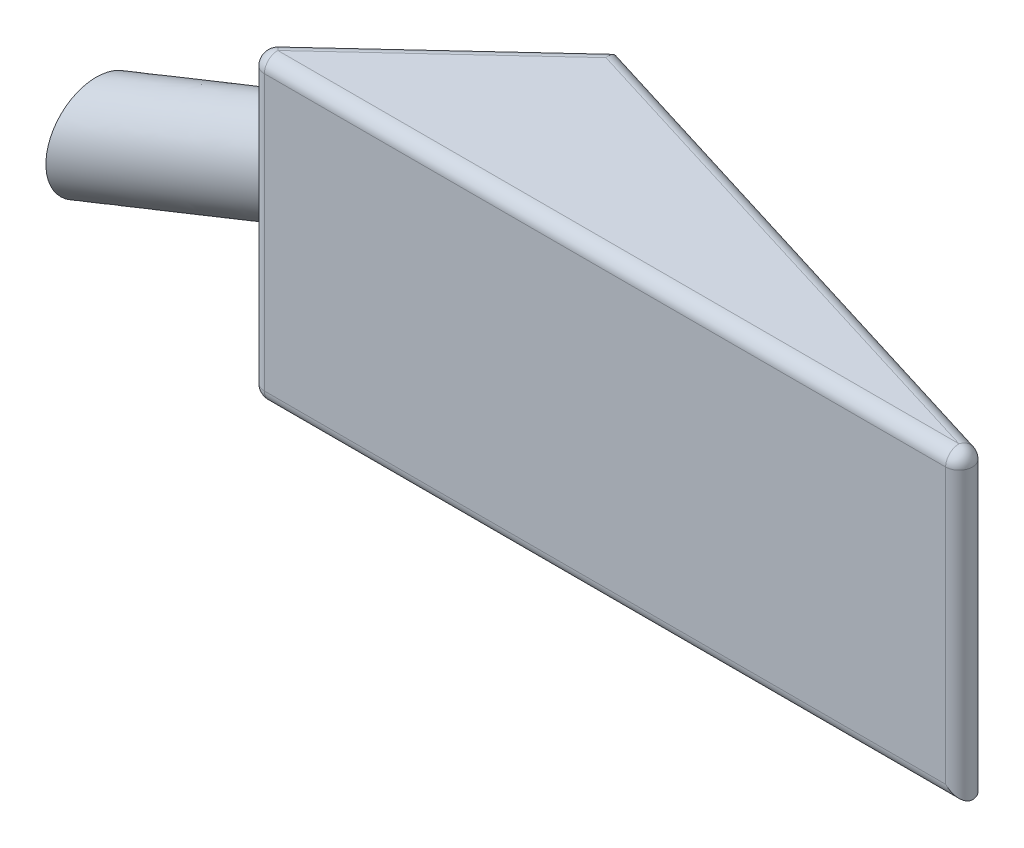
ISO-10303-21;
HEADER;
FILE_DESCRIPTION(('STEP AP214'),'2;1');
FILE_NAME('part.step','',(''),(''),'','','');
FILE_SCHEMA(('AUTOMOTIVE_DESIGN { 1 0 10303 214 1 1 1 1 }'));
ENDSEC;
DATA;
#1=APPLICATION_CONTEXT('core data for automotive mechanical design processes');
#2=APPLICATION_PROTOCOL_DEFINITION('international standard','automotive_design',2000,#1);
#3=PRODUCT_CONTEXT('',#1,'mechanical');
#4=PRODUCT('Part','Part','',(#3));
#5=PRODUCT_RELATED_PRODUCT_CATEGORY('part','',(#4));
#6=PRODUCT_DEFINITION_FORMATION('','',#4);
#7=PRODUCT_DEFINITION_CONTEXT('part definition',#1,'design');
#8=PRODUCT_DEFINITION('design','',#6,#7);
#9=PRODUCT_DEFINITION_SHAPE('','',#8);
#10=(LENGTH_UNIT() NAMED_UNIT(*) SI_UNIT(.MILLI.,.METRE.));
#11=(NAMED_UNIT(*) PLANE_ANGLE_UNIT() SI_UNIT($,.RADIAN.));
#12=(NAMED_UNIT(*) SI_UNIT($,.STERADIAN.) SOLID_ANGLE_UNIT());
#13=UNCERTAINTY_MEASURE_WITH_UNIT(LENGTH_MEASURE(1.E-05),#10,'distance_accuracy_value','');
#14=(GEOMETRIC_REPRESENTATION_CONTEXT(3) GLOBAL_UNCERTAINTY_ASSIGNED_CONTEXT((#13)) GLOBAL_UNIT_ASSIGNED_CONTEXT((#10,
#11,#12)) REPRESENTATION_CONTEXT('',''));
#15=CARTESIAN_POINT('',(0.,0.,0.));
#16=DIRECTION('',(0.,0.,1.));
#17=DIRECTION('',(1.,0.,0.));
#18=AXIS2_PLACEMENT_3D('',#15,#16,#17);
#19=CARTESIAN_POINT('',(20.,22.5,0.));
#20=DIRECTION('',(0.,0.,-1.));
#21=DIRECTION('',(-1.,0.,0.));
#22=AXIS2_PLACEMENT_3D('',#19,#20,#21);
#23=PLANE('',#22);
#24=DIRECTION('',(1.,0.,0.));
#25=VECTOR('',#24,1.);
#26=CARTESIAN_POINT('',(20.,-20.5,0.));
#27=LINE('',#26,#25);
#28=CARTESIAN_POINT('',(25.0995398766592,-20.5,0.));
#29=VERTEX_POINT('',#28);
#30=CARTESIAN_POINT('',(126.75258807811,-20.5,0.));
#31=VERTEX_POINT('',#30);
#32=EDGE_CURVE('E41',#29,#31,#27,.T.);
#33=ORIENTED_EDGE('',*,*,#32,.T.);
#34=DIRECTION('',(0.,-1.,0.));
#35=VECTOR('',#34,1.);
#36=CARTESIAN_POINT('',(126.75258807811,22.5,0.));
#37=LINE('',#36,#35);
#38=CARTESIAN_POINT('',(126.75258807811,20.5,0.));
#39=VERTEX_POINT('',#38);
#40=EDGE_CURVE('E11',#31,#39,#37,.F.);
#41=ORIENTED_EDGE('',*,*,#40,.T.);
#42=DIRECTION('',(1.,0.,0.));
#43=VECTOR('',#42,1.);
#44=CARTESIAN_POINT('',(20.,20.5,0.));
#45=LINE('',#44,#43);
#46=CARTESIAN_POINT('',(25.0995398766592,20.5,0.));
#47=VERTEX_POINT('',#46);
#48=EDGE_CURVE('E151',#39,#47,#45,.F.);
#49=ORIENTED_EDGE('',*,*,#48,.T.);
#50=DIRECTION('',(0.,-1.,0.));
#51=VECTOR('',#50,1.);
#52=CARTESIAN_POINT('',(25.0995398766592,22.5,0.));
#53=LINE('',#52,#51);
#54=EDGE_CURVE('E52',#47,#29,#53,.T.);
#55=ORIENTED_EDGE('',*,*,#54,.T.);
#56=EDGE_LOOP('',(#33,#41,#49,#55));
#57=FACE_BOUND('',#56,.T.);
#58=ADVANCED_FACE('F32',(#57),#23,.F.);
#59=CARTESIAN_POINT('',(50.,22.5,-27.8089638326065));
#60=DIRECTION('',(-0.295216946131995,0.,0.955430245866489));
#61=DIRECTION('',(0.955430245866489,0.,0.295216946131995));
#62=AXIS2_PLACEMENT_3D('',#59,#60,#61);
#63=PLANE('',#62);
#64=DIRECTION('',(-0.955430245866489,0.,-0.295216946131995));
#65=VECTOR('',#64,1.);
#66=CARTESIAN_POINT('',(50.,-22.5,-27.8089638326065));
#67=LINE('',#66,#65);
#68=CARTESIAN_POINT('',(127.343021970374,-22.5,-3.91086049173298));
#69=VERTEX_POINT('',#68);
#70=CARTESIAN_POINT('',(52.2064716385717,-22.5,-27.1271894993319));
#71=VERTEX_POINT('',#70);
#72=EDGE_CURVE('E205',#69,#71,#67,.T.);
#73=ORIENTED_EDGE('',*,*,#72,.T.);
#74=CARTESIAN_POINT('',(52.2064716385717,-20.5,-27.1271894993319));
#75=DIRECTION('',(-0.295216946131995,0.,0.955430245866489));
#76=DIRECTION('',(-0.955430245866489,0.,-0.295216946131995));
#77=AXIS2_PLACEMENT_3D('',#74,#75,#76);
#78=ELLIPSE('',#77,2.3094010767585,2.);
#79=CARTESIAN_POINT('',(50.,-20.5,-27.8089638326065));
#80=VERTEX_POINT('',#79);
#81=EDGE_CURVE('E142',#71,#80,#78,.F.);
#82=ORIENTED_EDGE('',*,*,#81,.T.);
#83=DIRECTION('',(0.,-1.,0.));
#84=VECTOR('',#83,1.);
#85=CARTESIAN_POINT('',(50.,22.5,-27.8089638326065));
#86=LINE('',#85,#84);
#87=CARTESIAN_POINT('',(50.,20.5,-27.8089638326065));
#88=VERTEX_POINT('',#87);
#89=EDGE_CURVE('E109',#88,#80,#86,.T.);
#90=ORIENTED_EDGE('',*,*,#89,.F.);
#91=DIRECTION('',(-0.955430245866489,0.,-0.295216946131995));
#92=VECTOR('',#91,1.);
#93=CARTESIAN_POINT('',(140.,20.5,0.));
#94=LINE('',#93,#92);
#95=CARTESIAN_POINT('',(127.343021970374,20.5,-3.91086049173298));
#96=VERTEX_POINT('',#95);
#97=EDGE_CURVE('E140',#88,#96,#94,.F.);
#98=ORIENTED_EDGE('',*,*,#97,.T.);
#99=DIRECTION('',(0.,-1.,0.));
#100=VECTOR('',#99,1.);
#101=CARTESIAN_POINT('',(127.343021970374,22.5,-3.91086049173298));
#102=LINE('',#101,#100);
#103=EDGE_CURVE('E138',#96,#69,#102,.T.);
#104=ORIENTED_EDGE('',*,*,#103,.T.);
#105=EDGE_LOOP('',(#73,#82,#90,#98,#104));
#106=FACE_BOUND('',#105,.T.);
#107=ADVANCED_FACE('F198',(#106),#63,.F.);
#108=CARTESIAN_POINT('',(20.,22.5,0.));
#109=DIRECTION('',(0.679818391398396,0.,0.733380497911212));
#110=DIRECTION('',(0.733380497911213,0.,-0.679818391398396));
#111=AXIS2_PLACEMENT_3D('',#108,#109,#110);
#112=PLANE('',#111);
#113=ORIENTED_EDGE('',*,*,#89,.T.);
#114=DIRECTION('',(-0.733380497911213,0.,0.679818391398396));
#115=VECTOR('',#114,1.);
#116=CARTESIAN_POINT('',(20.,-20.5,0.));
#117=LINE('',#116,#115);
#118=CARTESIAN_POINT('',(23.7399030938624,-20.5,-3.46676099582243));
#119=VERTEX_POINT('',#118);
#120=EDGE_CURVE('E129',#80,#119,#117,.T.);
#121=ORIENTED_EDGE('',*,*,#120,.T.);
#122=DIRECTION('',(0.,-1.,0.));
#123=VECTOR('',#122,1.);
#124=CARTESIAN_POINT('',(23.7399030938624,22.5,-3.46676099582243));
#125=LINE('',#124,#123);
#126=CARTESIAN_POINT('',(23.7399030938624,20.5,-3.46676099582243));
#127=VERTEX_POINT('',#126);
#128=EDGE_CURVE('E116',#119,#127,#125,.F.);
#129=ORIENTED_EDGE('',*,*,#128,.T.);
#130=DIRECTION('',(-0.733380497911213,0.,0.679818391398396));
#131=VECTOR('',#130,1.);
#132=CARTESIAN_POINT('',(50.,20.5,-27.8089638326065));
#133=LINE('',#132,#131);
#134=EDGE_CURVE('E118',#127,#88,#133,.F.);
#135=ORIENTED_EDGE('',*,*,#134,.T.);
#136=EDGE_LOOP('',(#113,#121,#129,#135));
#137=FACE_BOUND('',#136,.T.);
#138=CARTESIAN_POINT('',(34.4351718879005,7.05725727542223,-13.3809057649361));
#139=CARTESIAN_POINT('',(34.2666463557644,7.00851173550859,-13.2246884173347));
#140=CARTESIAN_POINT('',(34.0987602181864,6.95556986586334,-13.0690637664046));
#141=CARTESIAN_POINT('',(33.7637860710534,6.84068090865594,-12.7585543016552));
#142=CARTESIAN_POINT('',(33.5967059285652,6.77869122672612,-12.6036767803352));
#143=CARTESIAN_POINT('',(33.2640492492716,6.64537707769271,-12.2953155282302));
#144=CARTESIAN_POINT('',(33.0984781819889,6.5740271454842,-12.1418368675038));
#145=CARTESIAN_POINT('',(32.7695624876597,6.42162816389302,-11.8369433792512));
#146=CARTESIAN_POINT('',(32.6062202656825,6.34056943796994,-11.6855307811412));
#147=CARTESIAN_POINT('',(32.279954326841,6.16700444768412,-11.383093524706));
#148=CARTESIAN_POINT('',(32.1170750375898,6.07434236300427,-11.2321100492438));
#149=CARTESIAN_POINT('',(31.7951107434775,5.87809029901587,-10.9336602688984));
#150=CARTESIAN_POINT('',(31.6360215416193,5.77451316902596,-10.7861900735441));
#151=CARTESIAN_POINT('',(31.3224412700376,5.55581895582182,-10.4955119925096));
#152=CARTESIAN_POINT('',(31.1679439162717,5.44071868381473,-10.3522982817393));
#153=CARTESIAN_POINT('',(30.8643991988507,5.19819319093363,-10.0709228127946));
#154=CARTESIAN_POINT('',(30.7153469660328,5.07077937231094,-9.93275654107456));
#155=CARTESIAN_POINT('',(30.4554154015352,4.83180803243902,-9.69180895853896));
#156=CARTESIAN_POINT('',(30.3432707654228,4.72280873205109,-9.58785475421661));
#157=CARTESIAN_POINT('',(30.1236980526393,4.49626919499034,-9.3843184332692));
#158=CARTESIAN_POINT('',(30.0162700278018,4.37872886449285,-9.28473636469208));
#159=CARTESIAN_POINT('',(29.8071491127297,4.13487193435841,-9.09088849922933));
#160=CARTESIAN_POINT('',(29.7054484328564,4.00856780331097,-8.99661548161761));
#161=CARTESIAN_POINT('',(29.508663147057,3.74667278119662,-8.81420231843161));
#162=CARTESIAN_POINT('',(29.413578564228,3.61108185771246,-8.72606219426748));
#163=CARTESIAN_POINT('',(29.2299477560936,3.32831051155724,-8.55584277753537));
#164=CARTESIAN_POINT('',(29.1415166934519,3.18099024884706,-8.47387023677915));
#165=CARTESIAN_POINT('',(28.9742756500014,2.87643311694464,-8.31884356582424));
#166=CARTESIAN_POINT('',(28.8954668079721,2.71919507732724,-8.24579049123494));
#167=CARTESIAN_POINT('',(28.7494205179265,2.39549827009103,-8.11041062464276));
#168=CARTESIAN_POINT('',(28.6821552800226,2.22906295939808,-8.04805807237408));
#169=CARTESIAN_POINT('',(28.5608845178333,1.8874547696331,-7.93564426438491));
#170=CARTESIAN_POINT('',(28.5068710933288,1.71228717173054,-7.88557568543421));
#171=CARTESIAN_POINT('',(28.4290163726528,1.41268926886773,-7.81340704838505));
#172=CARTESIAN_POINT('',(28.4010705414174,1.29022302290192,-7.78750222804846));
#173=CARTESIAN_POINT('',(28.3525767126025,1.04260755069271,-7.74255012366116));
#174=CARTESIAN_POINT('',(28.3320267711739,0.917459038600478,-7.72350103772952));
#175=CARTESIAN_POINT('',(28.29874240238,0.665298581622131,-7.69264757746348));
#176=CARTESIAN_POINT('',(28.2860043358752,0.538287532671818,-7.6808398297725));
#177=CARTESIAN_POINT('',(28.2686010427435,0.283231099087787,-7.6647075781302));
#178=CARTESIAN_POINT('',(28.2639360920077,0.15518567925563,-7.66038332992056));
#179=CARTESIAN_POINT('',(28.2627836188831,-0.101142011411578,-7.65931502713924));
#180=CARTESIAN_POINT('',(28.2663068405275,-0.229424372497461,-7.66258093191528));
#181=CARTESIAN_POINT('',(28.2814738626225,-0.485088598392335,-7.67664023754478));
#182=CARTESIAN_POINT('',(28.2931176430055,-0.612470465425835,-7.68743361979638));
#183=CARTESIAN_POINT('',(28.3242787264751,-0.865471868508687,-7.7163188679027));
#184=CARTESIAN_POINT('',(28.3437990042415,-0.991090720160142,-7.73441349118305));
#185=CARTESIAN_POINT('',(28.3903143632509,-1.23971916171773,-7.77753162239476));
#186=CARTESIAN_POINT('',(28.4173096377802,-1.36272868406395,-7.80255530949603));
#187=CARTESIAN_POINT('',(28.4782024846865,-1.60520326143158,-7.85900087540541));
#188=CARTESIAN_POINT('',(28.5120841339504,-1.7246757777208,-7.89040799403767));
#189=CARTESIAN_POINT('',(28.586231701882,-1.95989767725495,-7.95914022853391));
#190=CARTESIAN_POINT('',(28.6264996397464,-2.0756458689847,-7.99646721612336));
#191=CARTESIAN_POINT('',(28.7559846856204,-2.41666963008414,-8.11649538137582));
#192=CARTESIAN_POINT('',(28.8539120597094,-2.63583653022257,-8.2072706748512));
#193=CARTESIAN_POINT('',(29.1367605395608,-3.19022141949315,-8.46946144639438));
#194=CARTESIAN_POINT('',(29.3373874094399,-3.51054806080852,-8.65543562533831));
#195=CARTESIAN_POINT('',(29.6636613320182,-3.95574968751956,-8.95788028242169));
#196=CARTESIAN_POINT('',(29.7768762273342,-4.09850162585888,-9.0628265800602));
#197=CARTESIAN_POINT('',(30.0104154360392,-4.37281748451371,-9.27930936033936));
#198=CARTESIAN_POINT('',(30.1307393666083,-4.50438200634006,-9.39084548811918));
#199=CARTESIAN_POINT('',(30.4508131667826,-4.83220740280478,-9.68754284587964));
#200=CARTESIAN_POINT('',(30.655106908679,-5.02021721231013,-9.87691608853371));
#201=CARTESIAN_POINT('',(31.0748833984352,-5.37147755871799,-10.2660343959139));
#202=CARTESIAN_POINT('',(31.2903735019246,-5.53471153545573,-10.4657862790547));
#203=CARTESIAN_POINT('',(31.7300952672437,-5.83867146569735,-10.8733931679936));
#204=CARTESIAN_POINT('',(31.9543398934439,-5.97936233146876,-11.0812601913156));
#205=CARTESIAN_POINT('',(32.4091657596899,-6.23968419531324,-11.5028680601346));
#206=CARTESIAN_POINT('',(32.6397447821202,-6.35932245777284,-11.7166068499786));
#207=CARTESIAN_POINT('',(33.1290755793215,-6.59004993120531,-12.1701995980303));
#208=CARTESIAN_POINT('',(33.3883448168528,-6.69909870738837,-12.4105332263441));
#209=CARTESIAN_POINT('',(33.7796955379193,-6.8458142864145,-12.7733018279442));
#210=CARTESIAN_POINT('',(33.9101408659093,-6.89179184341512,-12.8942201415511));
#211=CARTESIAN_POINT('',(34.171979188951,-6.97845510685196,-13.1369352233997));
#212=CARTESIAN_POINT('',(34.3033722173921,-7.01914062586867,-13.2587320225922));
#213=CARTESIAN_POINT('',(34.4351718879005,-7.05725727542223,-13.3809057649361));
#214=B_SPLINE_CURVE_WITH_KNOTS('',3,(#138,#139,#140,#141,#142,#143,#144,#145,#146,#147,#148,
#149,#150,#151,#152,#153,#154,#155,#156,#157,#158,#159,#160,#161,#162,#163,#164,#165,#166,#167,
#168,#169,#170,#171,#172,#173,#174,#175,#176,#177,#178,#179,#180,#181,#182,#183,#184,#185,#186,
#187,#188,#189,#190,#191,#192,#193,#194,#195,#196,#197,#198,#199,#200,#201,#202,#203,#204,#205,
#206,#207,#208,#209,#210,#211,#212,#213),.UNSPECIFIED.,.F.,.F.,(4,2,2,2,2,2,2,2,2,2,2,2,2,2,2,2,
2,2,2,2,2,2,2,2,2,2,2,2,2,2,2,2,2,2,2,2,2,4),(0.,0.704705582566311,1.41284263087102,
2.1229477868549,2.83376667230324,3.55543319508214,4.27625945829788,4.99604901666943,
5.71517832782119,6.27827028886703,6.8413684365096,7.40368125040803,7.96599602726231,
8.5364864355573,9.10704429547756,9.67620872513158,10.2450330119152,10.6294264817583,
11.0137188482173,11.3978320569257,11.7819583920883,12.1665890395194,12.5512187364569,
12.9359938308602,13.3207788756053,13.7046841161628,14.0887109815481,14.856411308746,
16.1125940156167,16.7430383842454,17.3734488344781,18.3801051800695,19.3874314394046,
20.3963106556446,21.4048410636447,22.5138870683601,23.0649655659431,23.6160635748686),.UNSPECIFIED.);
#215=CARTESIAN_POINT('',(34.4351718879005,7.05725727542223,-13.3809057649361));
#216=VERTEX_POINT('',#215);
#217=CARTESIAN_POINT('',(34.4351718879005,-7.05725727542223,-13.3809057649361));
#218=VERTEX_POINT('',#217);
#219=EDGE_CURVE('E101',#216,#218,#214,.T.);
#220=ORIENTED_EDGE('',*,*,#219,.T.);
#221=DIRECTION('',(0.,1.,0.));
#222=VECTOR('',#221,1.);
#223=CARTESIAN_POINT('',(34.4351718879005,22.5,-13.3809057649361));
#224=LINE('',#223,#222);
#225=EDGE_CURVE('E108',#218,#216,#224,.T.);
#226=ORIENTED_EDGE('',*,*,#225,.T.);
#227=EDGE_LOOP('',(#220,#226));
#228=FACE_BOUND('',#227,.T.);
#229=ADVANCED_FACE('F115',(#137,#228),#112,.F.);
#230=CARTESIAN_POINT('',(0.,22.5,0.));
#231=DIRECTION('',(0.,1.,0.));
#232=DIRECTION('',(0.,0.,1.));
#233=AXIS2_PLACEMENT_3D('',#230,#231,#232);
#234=PLANE('',#233);
#235=DIRECTION('',(-0.955430245866489,0.,-0.295216946131995));
#236=VECTOR('',#235,1.);
#237=CARTESIAN_POINT('',(49.409566107736,22.5,-25.8981033408736));
#238=LINE('',#237,#236);
#239=CARTESIAN_POINT('',(126.75258807811,22.5,-2.));
#240=VERTEX_POINT('',#239);
#241=CARTESIAN_POINT('',(50.5128019270219,22.5,-25.5572161742363));
#242=VERTEX_POINT('',#241);
#243=EDGE_CURVE('E146',#240,#242,#238,.T.);
#244=ORIENTED_EDGE('',*,*,#243,.T.);
#245=DIRECTION('',(-0.733380497911213,0.,0.679818391398396));
#246=VECTOR('',#245,1.);
#247=CARTESIAN_POINT('',(21.3596367827968,22.5,1.46676099582242));
#248=LINE('',#247,#246);
#249=CARTESIAN_POINT('',(25.0995398766592,22.5,-2.));
#250=VERTEX_POINT('',#249);
#251=EDGE_CURVE('E148',#242,#250,#248,.T.);
#252=ORIENTED_EDGE('',*,*,#251,.T.);
#253=DIRECTION('',(1.,0.,0.));
#254=VECTOR('',#253,1.);
#255=CARTESIAN_POINT('',(140.,22.5,-2.));
#256=LINE('',#255,#254);
#257=EDGE_CURVE('E144',#250,#240,#256,.T.);
#258=ORIENTED_EDGE('',*,*,#257,.T.);
#259=EDGE_LOOP('',(#244,#252,#258));
#260=FACE_BOUND('',#259,.T.);
#261=ADVANCED_FACE('F246',(#260),#234,.T.);
#262=CARTESIAN_POINT('',(0.,-22.5,0.));
#263=DIRECTION('',(0.,1.,0.));
#264=DIRECTION('',(0.,0.,1.));
#265=AXIS2_PLACEMENT_3D('',#262,#263,#264);
#266=PLANE('',#265);
#267=DIRECTION('',(1.,0.,0.));
#268=VECTOR('',#267,1.);
#269=CARTESIAN_POINT('',(0.,-22.5,-2.));
#270=LINE('',#269,#268);
#271=CARTESIAN_POINT('',(128.75258807811,-22.5,-2.));
#272=VERTEX_POINT('',#271);
#273=CARTESIAN_POINT('',(25.0995398766592,-22.5,-2.));
#274=VERTEX_POINT('',#273);
#275=EDGE_CURVE('E132',#272,#274,#270,.F.);
#276=ORIENTED_EDGE('',*,*,#275,.T.);
#277=DIRECTION('',(-0.733380497911213,0.,0.679818391398396));
#278=VECTOR('',#277,1.);
#279=CARTESIAN_POINT('',(10.6026976884668,-22.5,11.4380720032815));
#280=LINE('',#279,#278);
#281=EDGE_CURVE('E136',#274,#71,#280,.F.);
#282=ORIENTED_EDGE('',*,*,#281,.T.);
#283=ORIENTED_EDGE('',*,*,#72,.F.);
#284=CARTESIAN_POINT('',(126.75258807811,-22.5,-2.));
#285=DIRECTION('',(0.,1.,0.));
#286=DIRECTION('',(0.,0.,1.));
#287=AXIS2_PLACEMENT_3D('',#284,#285,#286);
#288=CIRCLE('',#287,2.);
#289=EDGE_CURVE('E134',#69,#272,#288,.F.);
#290=ORIENTED_EDGE('',*,*,#289,.T.);
#291=EDGE_LOOP('',(#276,#282,#283,#290));
#292=FACE_BOUND('',#291,.T.);
#293=ADVANCED_FACE('F245',(#292),#266,.F.);
#294=CARTESIAN_POINT('',(35.3126685390919,0.,-15.7631566702037));
#295=DIRECTION('',(0.938365441948618,0.,0.345644756009078));
#296=DIRECTION('',(0.345644756009078,0.,-0.938365441948618));
#297=AXIS2_PLACEMENT_3D('',#294,#295,#296);
#298=PLANE('',#297);
#299=ORIENTED_EDGE('',*,*,#225,.F.);
#300=CARTESIAN_POINT('',(35.3126685390919,0.,-15.7631566702037));
#301=DIRECTION('',(0.938365441948618,0.,0.345644756009078));
#302=DIRECTION('',(0.345644756009078,0.,-0.938365441948618));
#303=AXIS2_PLACEMENT_3D('',#300,#301,#302);
#304=CIRCLE('',#303,7.5);
#305=EDGE_CURVE('E104',#218,#216,#304,.T.);
#306=ORIENTED_EDGE('',*,*,#305,.T.);
#307=EDGE_LOOP('',(#299,#306));
#308=FACE_BOUND('',#307,.T.);
#309=ADVANCED_FACE('F112',(#308),#298,.T.);
#310=CARTESIAN_POINT('',(13.999320131699,0.,-17.0853376045907));
#311=CARTESIAN_POINT('',(37.90500420916,0.,-22.8008974848183));
#312=CARTESIAN_POINT('',(13.999320131699,15.,-17.0853376045907));
#313=CARTESIAN_POINT('',(37.90500420916,15.,-22.8008974848183));
#314=CARTESIAN_POINT('',(8.81464879156285,15.,-3.00985597536146));
#315=CARTESIAN_POINT('',(32.7203328690238,15.,-8.72541585558904));
#316=CARTESIAN_POINT('',(8.81464879156285,0.,-3.00985597536146));
#317=CARTESIAN_POINT('',(32.7203328690238,0.,-8.72541585558904));
#318=CARTESIAN_POINT('',(8.81464879156285,-15.,-3.00985597536146));
#319=CARTESIAN_POINT('',(32.7203328690238,-15.,-8.72541585558903));
#320=CARTESIAN_POINT('',(13.999320131699,-15.,-17.0853376045907));
#321=CARTESIAN_POINT('',(37.90500420916,-15.,-22.8008974848183));
#322=CARTESIAN_POINT('',(13.999320131699,0.,-17.0853376045907));
#323=CARTESIAN_POINT('',(37.90500420916,0.,-22.8008974848183));
#324=(BOUNDED_SURFACE() B_SPLINE_SURFACE(3,1,((#310,#311),(#312,#313),(#314,#315),(#316,#317),
(#318,#319),(#320,#321),(#322,#323)),.UNSPECIFIED.,.T.,.F.,.F.) B_SPLINE_SURFACE_WITH_KNOTS((4,
3,4),(2,2),(0.,0.5,1.),(0.,1.),
.UNSPECIFIED.) GEOMETRIC_REPRESENTATION_ITEM() RATIONAL_B_SPLINE_SURFACE(((1.,1.),
(0.333333333333333,0.333333333333333),(0.333333333333333,0.333333333333333),(1.,1.),
(0.333333333333333,0.333333333333333),(0.333333333333333,0.333333333333333),(1.,1.))) REPRESENTATION_ITEM('') SURFACE());
#325=CARTESIAN_POINT('',(14.6092157972986,0.,-17.2311562804391));
#326=CARTESIAN_POINT('',(14.609214925359,-0.239068672343024,-17.2311582803302));
#327=CARTESIAN_POINT('',(14.6130769959984,-0.478052825081239,-17.2223001883951));
#328=CARTESIAN_POINT('',(14.6285283283611,-0.954748947372926,-17.1868608255845));
#329=CARTESIAN_POINT('',(14.6401275720262,-1.19245887314848,-17.1602566600067));
#330=CARTESIAN_POINT('',(14.6867370438269,-1.90330051099605,-17.0533526116841));
#331=CARTESIAN_POINT('',(14.7335599856141,-2.37197033760295,-16.9459589460181));
#332=CARTESIAN_POINT('',(14.8587577129399,-3.28252113489102,-16.6588039241984));
#333=CARTESIAN_POINT('',(14.9371477789921,-3.72438901234675,-16.4790075204739));
#334=CARTESIAN_POINT('',(15.1084207318483,-4.48887920509149,-16.0861738040394));
#335=CARTESIAN_POINT('',(15.196159777467,-4.81865358463321,-15.8849344676932));
#336=CARTESIAN_POINT('',(15.3430558286917,-5.28270454090026,-15.5480119077105));
#337=CARTESIAN_POINT('',(15.3945867103651,-5.4323264012745,-15.4298200541729));
#338=CARTESIAN_POINT('',(15.5026019728778,-5.71987840440741,-15.1820749414923));
#339=CARTESIAN_POINT('',(15.5590841153782,-5.85781377543411,-15.0525268162302));
#340=CARTESIAN_POINT('',(15.6772925597425,-6.12153512618133,-14.7814024983553));
#341=CARTESIAN_POINT('',(15.7390596906812,-6.24720673630621,-14.6397326596826));
#342=CARTESIAN_POINT('',(15.8670555875736,-6.48327325877001,-14.3461597222974));
#343=CARTESIAN_POINT('',(15.9332819398019,-6.59367633850882,-14.194262159735));
#344=CARTESIAN_POINT('',(16.0697487159301,-6.79751763690374,-13.8812603112685));
#345=CARTESIAN_POINT('',(16.139987217893,-6.89096389024447,-13.7201604335427));
#346=CARTESIAN_POINT('',(16.2839280264954,-7.05930967419479,-13.3900160537857));
#347=CARTESIAN_POINT('',(16.3576296321806,-7.13421293894799,-13.2209731594718));
#348=CARTESIAN_POINT('',(16.4971658877701,-7.2548570381267,-12.9009311157839));
#349=CARTESIAN_POINT('',(16.5626393680606,-7.30322380899756,-12.7507603494047));
#350=CARTESIAN_POINT('',(16.6950995574425,-7.38449354460428,-12.4469480567646));
#351=CARTESIAN_POINT('',(16.7620860577161,-7.41739862976348,-12.2933070094504));
#352=CARTESIAN_POINT('',(16.8969620987215,-7.46720095104312,-11.9839536903037));
#353=CARTESIAN_POINT('',(16.9648510647933,-7.48410792153918,-11.8282427365183));
#354=CARTESIAN_POINT('',(17.1009629709259,-7.50166483591952,-11.5160548221665));
#355=CARTESIAN_POINT('',(17.169185888711,-7.50231584974147,-11.359577912692));
#356=CARTESIAN_POINT('',(17.2982933259255,-7.48813131709077,-11.0634555329787));
#357=CARTESIAN_POINT('',(17.3592068167859,-7.47489104870771,-10.9237436135154));
#358=CARTESIAN_POINT('',(17.4803639687364,-7.43552263046636,-10.6458561042524));
#359=CARTESIAN_POINT('',(17.5406076464043,-7.40939480030295,-10.5076804764296));
#360=CARTESIAN_POINT('',(17.6599979604282,-7.34459769075438,-10.2338454080072));
#361=CARTESIAN_POINT('',(17.7191447205508,-7.30592983549058,-10.0981856835349));
#362=CARTESIAN_POINT('',(17.8359638275325,-7.21653792310002,-9.83024796668649));
#363=CARTESIAN_POINT('',(17.8936361257577,-7.16581346886321,-9.69797008585758));
#364=CARTESIAN_POINT('',(18.0074627847209,-7.05260877387099,-9.43689588398189));
#365=CARTESIAN_POINT('',(18.0636073436302,-6.99006693330743,-9.30812204452788));
#366=CARTESIAN_POINT('',(18.1737661699756,-6.85408753028216,-9.05546042791145));
#367=CARTESIAN_POINT('',(18.2277797167056,-6.78064632097933,-8.93157430376922));
#368=CARTESIAN_POINT('',(18.3333935347664,-6.62364625283215,-8.68933717313186));
#369=CARTESIAN_POINT('',(18.3849941423477,-6.54008880957542,-8.57098539540864));
#370=CARTESIAN_POINT('',(18.4855867145553,-6.36363187142213,-8.34026505499859));
#371=CARTESIAN_POINT('',(18.534577727052,-6.27072900200839,-8.22789867612775));
#372=CARTESIAN_POINT('',(18.6865179469176,-5.96048012365951,-7.87940674993453));
#373=CARTESIAN_POINT('',(18.7842155010663,-5.72673886516057,-7.65532645796311));
#374=CARTESIAN_POINT('',(18.9649536470592,-5.22626067695307,-7.2407832600568));
#375=CARTESIAN_POINT('',(19.047986950273,-4.95950745057251,-7.05033707141253));
#376=CARTESIAN_POINT('',(19.1666446224581,-4.51973994094425,-6.77818239917398));
#377=CARTESIAN_POINT('',(19.2073952726213,-4.35521003292213,-6.68471621502876));
#378=CARTESIAN_POINT('',(19.2838436783466,-4.01895405380347,-6.50937322691691));
#379=CARTESIAN_POINT('',(19.3195418284815,-3.84722854600333,-6.42749551795307));
#380=CARTESIAN_POINT('',(19.3858607828153,-3.49771874288531,-6.27538556208136));
#381=CARTESIAN_POINT('',(19.4164806882437,-3.31993338176545,-6.20515537660421));
#382=CARTESIAN_POINT('',(19.4726457743124,-2.95931855281979,-6.07633445580898));
#383=CARTESIAN_POINT('',(19.4981874313959,-2.77648568224712,-6.01775180216357));
#384=CARTESIAN_POINT('',(19.5740555696832,-2.16665609006165,-5.8437397224665));
#385=CARTESIAN_POINT('',(19.6135007483183,-1.73087947922191,-5.75326778360953));
#386=CARTESIAN_POINT('',(19.665520660109,-0.849315551861106,-5.63395428467959));
#387=CARTESIAN_POINT('',(19.6780800537696,-0.403522667101237,-5.60514790745804));
#388=CARTESIAN_POINT('',(19.6767804983103,0.286963463194153,-5.60812858357926));
#389=CARTESIAN_POINT('',(19.6722596694963,0.531969141195052,-5.61849761123219));
#390=CARTESIAN_POINT('',(19.6551026980809,1.02001597977477,-5.65784904840581));
#391=CARTESIAN_POINT('',(19.6424741573516,1.26305876485999,-5.68681402218066));
#392=CARTESIAN_POINT('',(19.6090758449604,1.7458711519735,-5.76341679547612));
#393=CARTESIAN_POINT('',(19.5882977290515,1.985637137715,-5.81107373346246));
#394=CARTESIAN_POINT('',(19.5385760032392,2.45988297721306,-5.92511608523283));
#395=CARTESIAN_POINT('',(19.5096306338698,2.69436168016657,-5.99150553454947));
#396=CARTESIAN_POINT('',(19.4435624445315,3.15601550373593,-6.14304033279431));
#397=CARTESIAN_POINT('',(19.4064395378588,3.38319054688421,-6.22818588058727));
#398=CARTESIAN_POINT('',(19.3240213046304,3.82810533366056,-6.41722133727309));
#399=CARTESIAN_POINT('',(19.2787256728955,4.04584472457375,-6.52111194612831));
#400=CARTESIAN_POINT('',(19.1800892614926,4.46919868681092,-6.7473456124545));
#401=CARTESIAN_POINT('',(19.1267604552118,4.67483068010354,-6.86966120761966));
#402=CARTESIAN_POINT('',(19.0121420672505,5.07167636680949,-7.13255132870236));
#403=CARTESIAN_POINT('',(18.9508554823256,5.26289544523802,-7.27311898122494));
#404=CARTESIAN_POINT('',(18.8384735106898,5.57791026810126,-7.53087963077125));
#405=CARTESIAN_POINT('',(18.7892014904015,5.70580068218455,-7.64389053251205));
#406=CARTESIAN_POINT('',(18.6867463838844,5.95135553208582,-7.87888280414416));
#407=CARTESIAN_POINT('',(18.6335640664622,6.06902196817545,-8.00086241069123));
#408=CARTESIAN_POINT('',(18.523505319567,6.29289441735006,-8.25329448387019));
#409=CARTESIAN_POINT('',(18.466630348081,6.39910491008247,-8.38374360644544));
#410=CARTESIAN_POINT('',(18.3494314136331,6.59890212771457,-8.65255250016483));
#411=CARTESIAN_POINT('',(18.289107321523,6.69248837947327,-8.79091256752487));
#412=CARTESIAN_POINT('',(18.1649542399229,6.86638880879176,-9.07567157727163));
#413=CARTESIAN_POINT('',(18.1011050436883,6.94661290437662,-9.22211686609246));
#414=CARTESIAN_POINT('',(17.9707059441547,7.09187840106262,-9.52120181812499));
#415=CARTESIAN_POINT('',(17.9041563187039,7.1569213595297,-9.67384084406105));
#416=CARTESIAN_POINT('',(17.7689022012736,7.27078366658336,-9.98406132386919));
#417=CARTESIAN_POINT('',(17.7001986282273,7.31960983333515,-10.1416406700652));
#418=CARTESIAN_POINT('',(17.5612158232921,7.40024246577969,-10.4604133126377));
#419=CARTESIAN_POINT('',(17.4909367868761,7.43205103085691,-10.6216061606754));
#420=CARTESIAN_POINT('',(17.3573827815998,7.47551561640528,-10.9279272426821));
#421=CARTESIAN_POINT('',(17.2942033210951,7.48902730091835,-11.0728364175315));
#422=CARTESIAN_POINT('',(17.1676159869489,7.501994673823,-11.3631786583634));
#423=CARTESIAN_POINT('',(17.104208129587,7.50145134494006,-11.5086116870072));
#424=CARTESIAN_POINT('',(16.9776797198401,7.48631927872207,-11.7988187781242));
#425=CARTESIAN_POINT('',(16.9145590927183,7.47173443304133,-11.9435930120147));
#426=CARTESIAN_POINT('',(16.7890757373816,7.42873604787023,-12.2314031536953));
#427=CARTESIAN_POINT('',(16.7267130057466,7.40032257080531,-12.3744390693295));
#428=CARTESIAN_POINT('',(16.6060358928776,7.3316757534759,-12.6512255551486));
#429=CARTESIAN_POINT('',(16.5476667652558,7.29204209048466,-12.7851016923105));
#430=CARTESIAN_POINT('',(16.4323929141346,7.20101922444084,-13.0494951916255));
#431=CARTESIAN_POINT('',(16.3754886678007,7.14962624352901,-13.1800114593459));
#432=CARTESIAN_POINT('',(16.2635111957093,7.03570158324859,-13.4368443438441));
#433=CARTESIAN_POINT('',(16.2084374796629,6.97317291545807,-13.5631620851547));
#434=CARTESIAN_POINT('',(16.1003727159482,6.83761872022031,-13.811020734391));
#435=CARTESIAN_POINT('',(16.0473824685848,6.76458920838096,-13.9325598067279));
#436=CARTESIAN_POINT('',(15.940764305717,6.60428475492308,-14.1771005147633));
#437=CARTESIAN_POINT('',(15.8872750416834,6.51643202811354,-14.2997841377712));
#438=CARTESIAN_POINT('',(15.7831454486087,6.3306939878372,-14.5386170320269));
#439=CARTESIAN_POINT('',(15.7325061615854,6.23280504133447,-14.6547639132898));
#440=CARTESIAN_POINT('',(15.5851753835546,5.92544508377505,-14.9926835679338));
#441=CARTESIAN_POINT('',(15.493009758609,5.7021876512778,-15.2040757601692));
#442=CARTESIAN_POINT('',(15.3109441382415,5.19557736566645,-15.6216636693586));
#443=CARTESIAN_POINT('',(15.2228521428799,4.90818926538311,-15.8237125355042));
#444=CARTESIAN_POINT('',(15.0641203480305,4.30458766275112,-16.1877817002331));
#445=CARTESIAN_POINT('',(14.9934948195338,3.98835087641672,-16.3497692666985));
#446=CARTESIAN_POINT('',(14.8603684794541,3.2840057393332,-16.6551094506371));
#447=CARTESIAN_POINT('',(14.8008446753027,2.89237322093755,-16.7916339678546));
#448=CARTESIAN_POINT('',(14.7055626405955,2.09192961148423,-17.010173995216));
#449=CARTESIAN_POINT('',(14.669789452429,1.68312950502349,-17.0922238123169));
#450=CARTESIAN_POINT('',(14.6214069794237,0.849566951448356,-17.203194437649));
#451=CARTESIAN_POINT('',(14.6092173460973,0.42465014057013,-17.2311527280957));
#452=CARTESIAN_POINT('',(14.6092157972986,0.,-17.2311562804391));
#453=B_SPLINE_CURVE_WITH_KNOTS('',3,(#325,#326,#327,#328,#329,#330,#331,#332,#333,#334,#335,
#336,#337,#338,#339,#340,#341,#342,#343,#344,#345,#346,#347,#348,#349,#350,#351,#352,#353,#354,
#355,#356,#357,#358,#359,#360,#361,#362,#363,#364,#365,#366,#367,#368,#369,#370,#371,#372,#373,
#374,#375,#376,#377,#378,#379,#380,#381,#382,#383,#384,#385,#386,#387,#388,#389,#390,#391,#392,
#393,#394,#395,#396,#397,#398,#399,#400,#401,#402,#403,#404,#405,#406,#407,#408,#409,#410,#411,
#412,#413,#414,#415,#416,#417,#418,#419,#420,#421,#422,#423,#424,#425,#426,#427,#428,#429,#430,
#431,#432,#433,#434,#435,#436,#437,#438,#439,#440,#441,#442,#443,#444,#445,#446,#447,#448,#449,
#450,#451,#452),.UNSPECIFIED.,.T.,.F.,(4,2,2,2,2,2,2,2,2,2,2,2,2,2,2,2,2,2,2,2,2,2,2,2,2,2,2,2,
2,2,2,2,2,2,2,2,2,2,2,2,2,2,2,2,2,2,2,2,2,2,2,2,2,2,2,2,2,2,2,2,2,2,2,4),(0.,0.716832950808962,
1.43459250100906,2.87655530247322,4.3192169471122,5.50235843116159,6.09428167868097,
6.68593869935737,7.28267105768827,7.87908296865493,8.47521153849673,9.07121996353114,
9.58295416582386,10.0946181681338,10.6059706375805,11.1172894506431,11.575706986327,
12.0341131508635,12.4924672742336,12.9508364965765,13.4116644620587,13.8726469659535,
14.3335650379138,14.794650143186,15.8050569102564,16.8159644789812,17.3961659539039,
17.9763220931996,18.5565808017976,19.1372407301598,20.4718673267654,21.8072551824429,
22.5423240612148,23.2767047365639,24.0118393061724,24.7471323664116,25.4824332230975,
26.217761542456,26.9520045110191,27.6859717745515,28.218374592174,28.7506730121247,
29.2827625256117,29.8148719756208,30.3504349757785,30.8859430107173,31.4212256115535,
31.9564421617625,32.4318136027551,32.9071518059023,33.3823583053579,33.8575626596479,
34.3110446288587,34.7646724910956,35.2181778582537,35.6718557577271,36.1516299778104,
36.6315784898868,37.5909429619124,38.673400987591,39.7567405360782,41.0087506688581,
42.2599715636154,43.5332593195685),.UNSPECIFIED.);
#454=CARTESIAN_POINT('',(14.6092157972986,0.,-17.2311562804391));
#455=VERTEX_POINT('',#454);
#456=EDGE_CURVE('E206',#455,#455,#453,.T.);
#457=ORIENTED_EDGE('',*,*,#456,.F.);
#458=EDGE_LOOP('',(#457));
#459=FACE_BOUND('',#458,.T.);
#460=ORIENTED_EDGE('',*,*,#219,.F.);
#461=ORIENTED_EDGE('',*,*,#305,.F.);
#462=EDGE_LOOP('',(#460,#461));
#463=FACE_BOUND('',#462,.T.);
#464=ADVANCED_FACE('F103',(#459,#463),#324,.T.);
#465=CARTESIAN_POINT('',(0.,0.,0.));
#466=DIRECTION('',(1.,0.,0.));
#467=DIRECTION('',(0.,0.,-1.));
#468=AXIS2_PLACEMENT_3D('',#465,#466,#467);
#469=PLANE('',#468);
#470=CARTESIAN_POINT('',(0.,0.,0.));
#471=DIRECTION('',(1.,0.,0.));
#472=DIRECTION('',(0.,0.,-1.));
#473=AXIS2_PLACEMENT_3D('',#470,#471,#472);
#474=CIRCLE('',#473,7.5);
#475=CARTESIAN_POINT('',(0.,0.,-7.5));
#476=VERTEX_POINT('',#475);
#477=EDGE_CURVE('E113',#476,#476,#474,.T.);
#478=ORIENTED_EDGE('',*,*,#477,.F.);
#479=EDGE_LOOP('',(#478));
#480=FACE_BOUND('',#479,.T.);
#481=ADVANCED_FACE('F222',(#480),#469,.F.);
#482=CARTESIAN_POINT('',(0.,0.,-7.5));
#483=CARTESIAN_POINT('',(20.0139114491206,0.,-20.8312083821964));
#484=CARTESIAN_POINT('',(0.,15.,-7.5));
#485=CARTESIAN_POINT('',(20.0139114491206,15.,-20.8312083821964));
#486=CARTESIAN_POINT('',(0.,15.,7.5));
#487=CARTESIAN_POINT('',(20.0139114491206,15.,-5.83120838219637));
#488=CARTESIAN_POINT('',(0.,0.,7.5));
#489=CARTESIAN_POINT('',(20.0139114491206,0.,-5.83120838219637));
#490=CARTESIAN_POINT('',(0.,-15.,7.5));
#491=CARTESIAN_POINT('',(20.0139114491206,-15.,-5.83120838219636));
#492=CARTESIAN_POINT('',(0.,-15.,-7.5));
#493=CARTESIAN_POINT('',(20.0139114491206,-15.,-20.8312083821964));
#494=CARTESIAN_POINT('',(0.,0.,-7.5));
#495=CARTESIAN_POINT('',(20.0139114491206,0.,-20.8312083821964));
#496=(BOUNDED_SURFACE() B_SPLINE_SURFACE(3,1,((#482,#483),(#484,#485),(#486,#487),(#488,#489),
(#490,#491),(#492,#493),(#494,#495)),.UNSPECIFIED.,.T.,.F.,.F.) B_SPLINE_SURFACE_WITH_KNOTS((4,
3,4),(2,2),(0.,0.5,1.),(0.,1.),
.UNSPECIFIED.) GEOMETRIC_REPRESENTATION_ITEM() RATIONAL_B_SPLINE_SURFACE(((1.,1.),
(0.333333333333333,0.333333333333333),(0.333333333333333,0.333333333333333),(1.,1.),
(0.333333333333333,0.333333333333333),(0.333333333333333,0.333333333333333),(1.,1.))) REPRESENTATION_ITEM('') SURFACE());
#497=CARTESIAN_POINT('',(0.,0.,-7.5));
#498=CARTESIAN_POINT('',(0.152179331221861,0.,-7.60136621125457));
#499=CARTESIAN_POINT('',(0.304358662443721,0.,-7.70273242250915));
#500=CARTESIAN_POINT('',(0.608717324887441,0.,-7.9054648450183));
#501=CARTESIAN_POINT('',(0.760896656109301,0.,-8.00683105627287));
#502=CARTESIAN_POINT('',(1.06525531855302,0.,-8.20956347878202));
#503=CARTESIAN_POINT('',(1.21743464977488,0.,-8.31092969003659));
#504=CARTESIAN_POINT('',(1.5217933122186,0.,-8.51366211254574));
#505=CARTESIAN_POINT('',(1.67397264344046,0.,-8.61502832380032));
#506=CARTESIAN_POINT('',(1.97833130588418,0.,-8.81776074630947));
#507=CARTESIAN_POINT('',(2.13051063710604,0.,-8.91912695756404));
#508=CARTESIAN_POINT('',(2.43486929954976,0.,-9.12185938007319));
#509=CARTESIAN_POINT('',(2.58704863077162,0.,-9.22322559132776));
#510=CARTESIAN_POINT('',(2.89140729321534,0.,-9.42595801383691));
#511=CARTESIAN_POINT('',(3.0435866244372,0.,-9.52732422509148));
#512=CARTESIAN_POINT('',(3.34794528688093,0.,-9.73005664760063));
#513=CARTESIAN_POINT('',(3.50012461810279,0.,-9.83142285885521));
#514=CARTESIAN_POINT('',(3.80448328054651,0.,-10.0341552813644));
#515=CARTESIAN_POINT('',(3.95666261176837,0.,-10.1355214926189));
#516=CARTESIAN_POINT('',(4.26102127421209,0.,-10.3382539151281));
#517=CARTESIAN_POINT('',(4.41320060543395,0.,-10.4396201263827));
#518=CARTESIAN_POINT('',(4.71755926787767,0.,-10.6423525488918));
#519=CARTESIAN_POINT('',(4.86973859909953,0.,-10.7437187601464));
#520=CARTESIAN_POINT('',(5.17409726154325,0.,-10.9464511826555));
#521=CARTESIAN_POINT('',(5.32627659276511,0.,-11.0478173939101));
#522=CARTESIAN_POINT('',(5.63063525520883,0.,-11.2505498164192));
#523=CARTESIAN_POINT('',(5.78281458643069,0.,-11.3519160276738));
#524=CARTESIAN_POINT('',(6.08717324887441,0.,-11.554648450183));
#525=CARTESIAN_POINT('',(6.23935258009627,0.,-11.6560146614375));
#526=CARTESIAN_POINT('',(6.54371124253999,0.,-11.8587470839467));
#527=CARTESIAN_POINT('',(6.69589057376185,0.,-11.9601132952013));
#528=CARTESIAN_POINT('',(7.00024923620557,0.,-12.1628457177104));
#529=CARTESIAN_POINT('',(7.15242856742743,0.,-12.264211928965));
#530=CARTESIAN_POINT('',(7.45678722987115,0.,-12.4669443514741));
#531=CARTESIAN_POINT('',(7.60896656109301,0.,-12.5683105627287));
#532=CARTESIAN_POINT('',(7.91332522353673,0.,-12.7710429852379));
#533=CARTESIAN_POINT('',(8.06550455475859,0.,-12.8724091964924));
#534=CARTESIAN_POINT('',(8.36986321720231,0.,-13.0751416190016));
#535=CARTESIAN_POINT('',(8.52204254842417,0.,-13.1765078302562));
#536=CARTESIAN_POINT('',(8.82640121086789,0.,-13.3792402527653));
#537=CARTESIAN_POINT('',(8.97858054208975,0.,-13.4806064640199));
#538=CARTESIAN_POINT('',(9.28293920453347,0.,-13.683338886529));
#539=CARTESIAN_POINT('',(9.43511853575533,0.,-13.7847050977836));
#540=CARTESIAN_POINT('',(9.73947719819905,0.,-13.9874375202928));
#541=CARTESIAN_POINT('',(9.89165652942092,0.,-14.0888037315473));
#542=CARTESIAN_POINT('',(10.1960151918646,0.,-14.2915361540565));
#543=CARTESIAN_POINT('',(10.3481945230865,0.,-14.3929023653111));
#544=CARTESIAN_POINT('',(10.6525531855302,0.,-14.5956347878202));
#545=CARTESIAN_POINT('',(10.8047325167521,0.,-14.6970009990748));
#546=CARTESIAN_POINT('',(11.1090911791958,0.,-14.8997334215839));
#547=CARTESIAN_POINT('',(11.2612705104177,0.,-15.0010996328385));
#548=CARTESIAN_POINT('',(11.5656291728614,0.,-15.2038320553476));
#549=CARTESIAN_POINT('',(11.7178085040832,0.,-15.3051982666022));
#550=CARTESIAN_POINT('',(12.022167166527,0.,-15.5079306891114));
#551=CARTESIAN_POINT('',(12.1743464977488,0.,-15.6092969003659));
#552=CARTESIAN_POINT('',(12.4787051601925,0.,-15.8120293228751));
#553=CARTESIAN_POINT('',(12.6308844914144,0.,-15.9133955341297));
#554=CARTESIAN_POINT('',(12.9352431538581,0.,-16.1161279566388));
#555=CARTESIAN_POINT('',(13.08742248508,0.,-16.2174941678934));
#556=CARTESIAN_POINT('',(13.3917811475237,0.,-16.4202265904025));
#557=CARTESIAN_POINT('',(13.5439604787456,0.,-16.5215928016571));
#558=CARTESIAN_POINT('',(13.8483191411893,0.,-16.7243252241663));
#559=CARTESIAN_POINT('',(14.0004984724111,0.,-16.8256914354208));
#560=CARTESIAN_POINT('',(14.3048571348549,0.,-17.02842385793));
#561=CARTESIAN_POINT('',(14.4570364660767,0.,-17.1297900691846));
#562=CARTESIAN_POINT('',(14.6092157972986,0.,-17.2311562804391));
#563=B_SPLINE_CURVE_WITH_KNOTS('',3,(#497,#498,#499,#500,#501,#502,#503,#504,#505,#506,#507,
#508,#509,#510,#511,#512,#513,#514,#515,#516,#517,#518,#519,#520,#521,#522,#523,#524,#525,#526,
#527,#528,#529,#530,#531,#532,#533,#534,#535,#536,#537,#538,#539,#540,#541,#542,#543,#544,#545,
#546,#547,#548,#549,#550,#551,#552,#553,#554,#555,#556,#557,#558,#559,#560,#561,#562),
.UNSPECIFIED.,.F.,.F.,(4,2,2,2,2,2,2,2,2,2,2,2,2,2,2,2,2,2,2,2,2,2,2,2,2,2,2,2,2,2,2,2,4),(0.,
0.548546186494042,1.09709237298808,1.64563855948213,2.19418474597617,2.74273093247021,
3.29127711896425,3.8398233054583,4.38836949195234,4.93691567844638,5.48546186494042,
6.03400805143447,6.58255423792851,7.13110042442255,7.67964661091659,8.22819279741064,
8.77673898390468,9.32528517039872,9.87383135689276,10.4223775433868,10.9709237298808,
11.5194699163749,12.0680161028689,12.616562289363,13.165108475857,13.7136546623511,
14.2622008488451,14.8107470353391,15.3592932218332,15.9078394083272,16.4563855948213,
17.0049317813153,17.5534779678094),.UNSPECIFIED.);
#564=EDGE_CURVE('BSEAM216',#476,#455,#563,.T.);
#565=ORIENTED_EDGE('',*,*,#477,.T.);
#566=ORIENTED_EDGE('',*,*,#456,.T.);
#567=ORIENTED_EDGE('',*,*,#564,.T.);
#568=ORIENTED_EDGE('',*,*,#564,.F.);
#569=EDGE_LOOP('',(#565,#567,#566,#568));
#570=FACE_BOUND('',#569,.T.);
#571=ADVANCED_FACE('F216',(#570),#496,.T.);
#572=CARTESIAN_POINT('',(11.6109924474262,20.5,-37.5774274280254));
#573=DIRECTION('',(0.955430245866489,0.,0.295216946131995));
#574=DIRECTION('',(0.295216946131995,0.,-0.955430245866489));
#575=AXIS2_PLACEMENT_3D('',#572,#573,#574);
#576=CYLINDRICAL_SURFACE('',#575,2.);
#577=CARTESIAN_POINT('',(126.75258807811,20.5,-2.));
#578=DIRECTION('',(0.955430245866489,0.,0.295216946131993));
#579=DIRECTION('',(0.295216946131993,0.,-0.955430245866489));
#580=AXIS2_PLACEMENT_3D('',#577,#578,#579);
#581=CIRCLE('',#580,2.);
#582=EDGE_CURVE('E176',#96,#240,#581,.T.);
#583=ORIENTED_EDGE('',*,*,#582,.F.);
#584=ORIENTED_EDGE('',*,*,#97,.F.);
#585=CARTESIAN_POINT('',(50.5128019270219,20.5,-25.5572161742363));
#586=DIRECTION('',(0.975035337530388,0.,-0.222049747955276));
#587=DIRECTION('',(0.222049747955276,0.,0.975035337530389));
#588=AXIS2_PLACEMENT_3D('',#585,#586,#587);
#589=ELLIPSE('',#588,2.3094010767585,2.);
#590=EDGE_CURVE('E36',#242,#88,#589,.F.);
#591=ORIENTED_EDGE('',*,*,#590,.F.);
#592=ORIENTED_EDGE('',*,*,#243,.F.);
#593=EDGE_LOOP('',(#583,#584,#591,#592));
#594=FACE_BOUND('',#593,.T.);
#595=ADVANCED_FACE('F34',(#594),#576,.T.);
#596=CARTESIAN_POINT('',(10.6026976884668,20.5,11.4380720032815));
#597=DIRECTION('',(0.733380497911213,0.,-0.679818391398396));
#598=DIRECTION('',(-0.679818391398396,0.,-0.733380497911213));
#599=AXIS2_PLACEMENT_3D('',#596,#597,#598);
#600=CYLINDRICAL_SURFACE('',#599,2.);
#601=ORIENTED_EDGE('',*,*,#590,.T.);
#602=ORIENTED_EDGE('',*,*,#134,.F.);
#603=CARTESIAN_POINT('',(25.0995398766592,20.5,-2.));
#604=DIRECTION('',(-0.733380497911214,0.,0.679818391398394));
#605=DIRECTION('',(0.679818391398394,0.,0.733380497911214));
#606=AXIS2_PLACEMENT_3D('',#603,#604,#605);
#607=CIRCLE('',#606,2.);
#608=EDGE_CURVE('E173',#250,#127,#607,.T.);
#609=ORIENTED_EDGE('',*,*,#608,.F.);
#610=ORIENTED_EDGE('',*,*,#251,.F.);
#611=EDGE_LOOP('',(#601,#602,#609,#610));
#612=FACE_BOUND('',#611,.T.);
#613=ADVANCED_FACE('F189',(#612),#600,.T.);
#614=CARTESIAN_POINT('',(0.,20.5,-2.));
#615=DIRECTION('',(-1.,0.,0.));
#616=DIRECTION('',(0.,0.,1.));
#617=AXIS2_PLACEMENT_3D('',#614,#615,#616);
#618=CYLINDRICAL_SURFACE('',#617,2.);
#619=CARTESIAN_POINT('',(126.75258807811,20.5,-2.));
#620=DIRECTION('',(1.,0.,0.));
#621=DIRECTION('',(0.,0.,-1.));
#622=AXIS2_PLACEMENT_3D('',#619,#620,#621);
#623=CIRCLE('',#622,2.);
#624=EDGE_CURVE('E178',#240,#39,#623,.T.);
#625=ORIENTED_EDGE('',*,*,#624,.F.);
#626=ORIENTED_EDGE('',*,*,#257,.F.);
#627=CARTESIAN_POINT('',(25.0995398766592,20.5,-2.));
#628=DIRECTION('',(-1.,0.,0.));
#629=DIRECTION('',(0.,-1.,0.));
#630=AXIS2_PLACEMENT_3D('',#627,#628,#629);
#631=CIRCLE('',#630,2.);
#632=EDGE_CURVE('E171',#47,#250,#631,.T.);
#633=ORIENTED_EDGE('',*,*,#632,.F.);
#634=ORIENTED_EDGE('',*,*,#48,.F.);
#635=EDGE_LOOP('',(#625,#626,#633,#634));
#636=FACE_BOUND('',#635,.T.);
#637=ADVANCED_FACE('F286',(#636),#618,.T.);
#638=CARTESIAN_POINT('',(126.75258807811,20.5,-2.));
#639=DIRECTION('',(0.,0.,1.));
#640=DIRECTION('',(1.,0.,0.));
#641=AXIS2_PLACEMENT_3D('',#638,#639,#640);
#642=SPHERICAL_SURFACE('',#641,2.);
#643=ORIENTED_EDGE('',*,*,#582,.T.);
#644=ORIENTED_EDGE('',*,*,#624,.T.);
#645=CARTESIAN_POINT('',(126.75258807811,20.5,-2.));
#646=DIRECTION('',(0.,1.,0.));
#647=DIRECTION('',(0.,0.,1.));
#648=AXIS2_PLACEMENT_3D('',#645,#646,#647);
#649=CIRCLE('',#648,2.);
#650=EDGE_CURVE('E169',#96,#39,#649,.F.);
#651=ORIENTED_EDGE('',*,*,#650,.F.);
#652=EDGE_LOOP('',(#643,#644,#651));
#653=FACE_BOUND('',#652,.T.);
#654=ADVANCED_FACE('F282',(#653),#642,.T.);
#655=CARTESIAN_POINT('',(25.0995398766592,20.5,-2.));
#656=DIRECTION('',(0.,0.,1.));
#657=DIRECTION('',(1.,0.,0.));
#658=AXIS2_PLACEMENT_3D('',#655,#656,#657);
#659=SPHERICAL_SURFACE('',#658,2.);
#660=ORIENTED_EDGE('',*,*,#632,.T.);
#661=ORIENTED_EDGE('',*,*,#608,.T.);
#662=CARTESIAN_POINT('',(25.0995398766592,20.5,-2.));
#663=DIRECTION('',(0.,1.,0.));
#664=DIRECTION('',(0.,0.,1.));
#665=AXIS2_PLACEMENT_3D('',#662,#663,#664);
#666=CIRCLE('',#665,2.);
#667=EDGE_CURVE('E166',#47,#127,#666,.F.);
#668=ORIENTED_EDGE('',*,*,#667,.F.);
#669=EDGE_LOOP('',(#660,#661,#668));
#670=FACE_BOUND('',#669,.T.);
#671=ADVANCED_FACE('F278',(#670),#659,.T.);
#672=CARTESIAN_POINT('',(126.75258807811,22.5,-2.));
#673=DIRECTION('',(0.,-1.,0.));
#674=DIRECTION('',(0.,0.,-1.));
#675=AXIS2_PLACEMENT_3D('',#672,#673,#674);
#676=CYLINDRICAL_SURFACE('',#675,2.);
#677=ORIENTED_EDGE('',*,*,#650,.T.);
#678=ORIENTED_EDGE('',*,*,#40,.F.);
#679=CARTESIAN_POINT('',(126.75258807811,-20.5,-2.));
#680=DIRECTION('',(0.707106781186548,0.707106781186547,0.));
#681=DIRECTION('',(0.707106781186548,-0.707106781186547,0.));
#682=AXIS2_PLACEMENT_3D('',#679,#680,#681);
#683=ELLIPSE('',#682,2.82842712474619,2.);
#684=EDGE_CURVE('E163',#272,#31,#683,.F.);
#685=ORIENTED_EDGE('',*,*,#684,.F.);
#686=ORIENTED_EDGE('',*,*,#289,.F.);
#687=ORIENTED_EDGE('',*,*,#103,.F.);
#688=EDGE_LOOP('',(#677,#678,#685,#686,#687));
#689=FACE_BOUND('',#688,.T.);
#690=ADVANCED_FACE('F274',(#689),#676,.T.);
#691=CARTESIAN_POINT('',(25.0995398766592,22.5,-2.));
#692=DIRECTION('',(0.,-1.,0.));
#693=DIRECTION('',(0.,0.,-1.));
#694=AXIS2_PLACEMENT_3D('',#691,#692,#693);
#695=CYLINDRICAL_SURFACE('',#694,2.);
#696=ORIENTED_EDGE('',*,*,#667,.T.);
#697=ORIENTED_EDGE('',*,*,#128,.F.);
#698=CARTESIAN_POINT('',(25.0995398766592,-20.5,-2.));
#699=DIRECTION('',(0.,-1.,0.));
#700=DIRECTION('',(0.,0.,-1.));
#701=AXIS2_PLACEMENT_3D('',#698,#699,#700);
#702=CIRCLE('',#701,2.);
#703=EDGE_CURVE('E160',#29,#119,#702,.T.);
#704=ORIENTED_EDGE('',*,*,#703,.F.);
#705=ORIENTED_EDGE('',*,*,#54,.F.);
#706=EDGE_LOOP('',(#696,#697,#704,#705));
#707=FACE_BOUND('',#706,.T.);
#708=ADVANCED_FACE('F270',(#707),#695,.T.);
#709=CARTESIAN_POINT('',(20.,-20.5,-2.));
#710=DIRECTION('',(1.,0.,0.));
#711=DIRECTION('',(0.,0.,-1.));
#712=AXIS2_PLACEMENT_3D('',#709,#710,#711);
#713=CYLINDRICAL_SURFACE('',#712,2.);
#714=ORIENTED_EDGE('',*,*,#684,.T.);
#715=ORIENTED_EDGE('',*,*,#32,.F.);
#716=CARTESIAN_POINT('',(25.0995398766592,-20.5,-2.));
#717=DIRECTION('',(-1.,0.,0.));
#718=DIRECTION('',(0.,0.,1.));
#719=AXIS2_PLACEMENT_3D('',#716,#717,#718);
#720=CIRCLE('',#719,2.);
#721=EDGE_CURVE('E157',#274,#29,#720,.T.);
#722=ORIENTED_EDGE('',*,*,#721,.F.);
#723=ORIENTED_EDGE('',*,*,#275,.F.);
#724=EDGE_LOOP('',(#714,#715,#722,#723));
#725=FACE_BOUND('',#724,.T.);
#726=ADVANCED_FACE('F266',(#725),#713,.T.);
#727=CARTESIAN_POINT('',(25.0995398766592,-20.5,-2.));
#728=DIRECTION('',(0.,0.,1.));
#729=DIRECTION('',(1.,0.,0.));
#730=AXIS2_PLACEMENT_3D('',#727,#728,#729);
#731=SPHERICAL_SURFACE('',#730,2.);
#732=ORIENTED_EDGE('',*,*,#721,.T.);
#733=ORIENTED_EDGE('',*,*,#703,.T.);
#734=CARTESIAN_POINT('',(25.0995398766592,-20.5,-2.));
#735=DIRECTION('',(-0.733380497911213,0.,0.679818391398395));
#736=DIRECTION('',(0.679818391398395,0.,0.733380497911213));
#737=AXIS2_PLACEMENT_3D('',#734,#735,#736);
#738=CIRCLE('',#737,2.);
#739=EDGE_CURVE('E155',#274,#119,#738,.F.);
#740=ORIENTED_EDGE('',*,*,#739,.F.);
#741=EDGE_LOOP('',(#732,#733,#740));
#742=FACE_BOUND('',#741,.T.);
#743=ADVANCED_FACE('F262',(#742),#731,.T.);
#744=CARTESIAN_POINT('',(21.3596367827968,-20.5,1.46676099582242));
#745=DIRECTION('',(-0.733380497911213,0.,0.679818391398396));
#746=DIRECTION('',(0.679818391398396,0.,0.733380497911213));
#747=AXIS2_PLACEMENT_3D('',#744,#745,#746);
#748=CYLINDRICAL_SURFACE('',#747,2.);
#749=ORIENTED_EDGE('',*,*,#81,.F.);
#750=ORIENTED_EDGE('',*,*,#281,.F.);
#751=ORIENTED_EDGE('',*,*,#739,.T.);
#752=ORIENTED_EDGE('',*,*,#120,.F.);
#753=EDGE_LOOP('',(#749,#750,#751,#752));
#754=FACE_BOUND('',#753,.T.);
#755=ADVANCED_FACE('F259',(#754),#748,.T.);
#756=CLOSED_SHELL('',(#58,#107,#229,#261,#293,#309,#464,#481,#571,#595,#613,#637,#654,#671,#690,
#708,#726,#743,#755));
#757=MANIFOLD_SOLID_BREP('B2',#756);
#758=ADVANCED_BREP_SHAPE_REPRESENTATION('',(#18,#757),#14);
#759=SHAPE_DEFINITION_REPRESENTATION(#9,#758);
ENDSEC;
END-ISO-10303-21;
